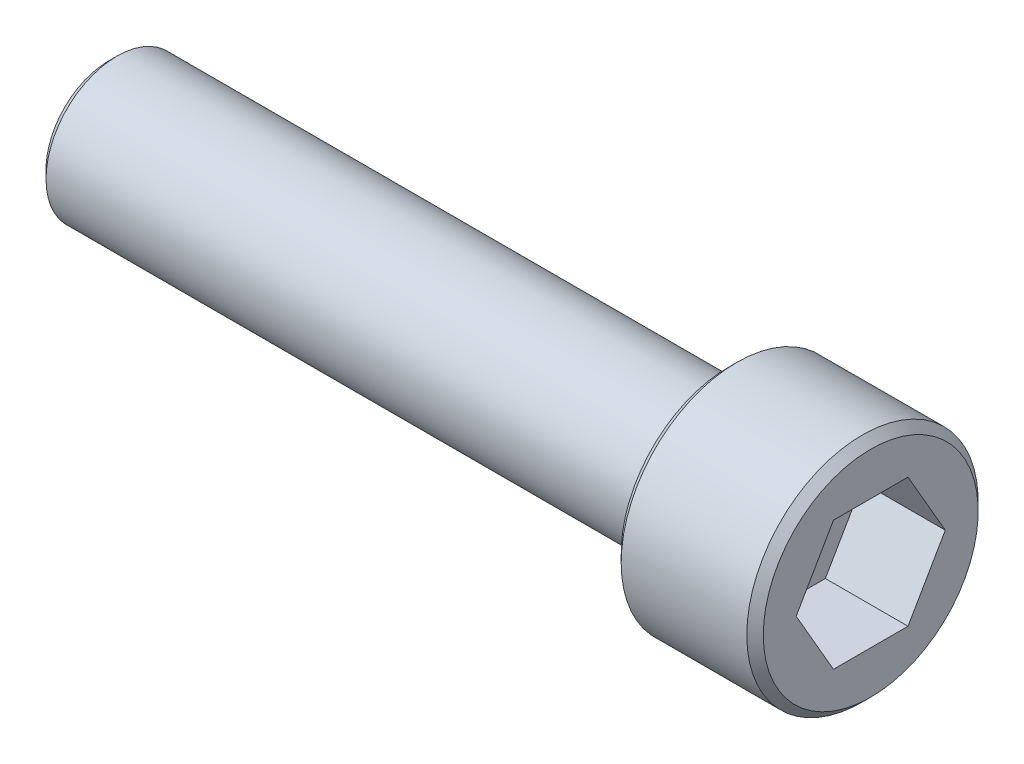
ISO-10303-21;
HEADER;
FILE_DESCRIPTION(('STEP AP214'),'2;1');
FILE_NAME('part.step','',(''),(''),'','','');
FILE_SCHEMA(('AUTOMOTIVE_DESIGN { 1 0 10303 214 1 1 1 1 }'));
ENDSEC;
DATA;
#1=APPLICATION_CONTEXT('core data for automotive mechanical design processes');
#2=APPLICATION_PROTOCOL_DEFINITION('international standard','automotive_design',2000,#1);
#3=PRODUCT_CONTEXT('',#1,'mechanical');
#4=PRODUCT('Part','Part','',(#3));
#5=PRODUCT_RELATED_PRODUCT_CATEGORY('part','',(#4));
#6=PRODUCT_DEFINITION_FORMATION('','',#4);
#7=PRODUCT_DEFINITION_CONTEXT('part definition',#1,'design');
#8=PRODUCT_DEFINITION('design','',#6,#7);
#9=PRODUCT_DEFINITION_SHAPE('','',#8);
#10=(LENGTH_UNIT() NAMED_UNIT(*) SI_UNIT(.MILLI.,.METRE.));
#11=(NAMED_UNIT(*) PLANE_ANGLE_UNIT() SI_UNIT($,.RADIAN.));
#12=(NAMED_UNIT(*) SI_UNIT($,.STERADIAN.) SOLID_ANGLE_UNIT());
#13=UNCERTAINTY_MEASURE_WITH_UNIT(LENGTH_MEASURE(1.E-05),#10,'distance_accuracy_value','');
#14=(GEOMETRIC_REPRESENTATION_CONTEXT(3) GLOBAL_UNCERTAINTY_ASSIGNED_CONTEXT((#13)) GLOBAL_UNIT_ASSIGNED_CONTEXT((#10,
#11,#12)) REPRESENTATION_CONTEXT('',''));
#15=CARTESIAN_POINT('',(0.,0.,0.));
#16=DIRECTION('',(0.,0.,1.));
#17=DIRECTION('',(1.,0.,0.));
#18=AXIS2_PLACEMENT_3D('',#15,#16,#17);
#19=CARTESIAN_POINT('',(10.4394,0.992187499999991,-0.572839720211604));
#20=DIRECTION('',(1.,0.,0.));
#21=DIRECTION('',(0.,0.,-1.));
#22=AXIS2_PLACEMENT_3D('',#19,#20,#21);
#23=PLANE('',#22);
#24=DIRECTION('',(0.,0.,-1.));
#25=VECTOR('',#24,1.);
#26=CARTESIAN_POINT('',(10.4393999999992,-0.992187499999797,0.572839720211604));
#27=LINE('',#26,#25);
#28=CARTESIAN_POINT('',(10.4393999999998,-0.992187499999804,0.572839720211616));
#29=VERTEX_POINT('',#28);
#30=CARTESIAN_POINT('',(10.4393999999994,-0.992187499999878,-0.57283972021157));
#31=VERTEX_POINT('',#30);
#32=EDGE_CURVE('E90',#29,#31,#27,.T.);
#33=ORIENTED_EDGE('',*,*,#32,.T.);
#34=DIRECTION('',(0.,0.866025403784437,-0.500000000000003));
#35=VECTOR('',#34,1.);
#36=CARTESIAN_POINT('',(10.4393999999992,-0.992187499999839,-0.572839720211604));
#37=LINE('',#36,#35);
#38=CARTESIAN_POINT('',(10.4393999999996,0.,-1.14567944042319));
#39=VERTEX_POINT('',#38);
#40=EDGE_CURVE('E134',#31,#39,#37,.T.);
#41=ORIENTED_EDGE('',*,*,#40,.T.);
#42=DIRECTION('',(0.,0.866025403784437,0.500000000000003));
#43=VECTOR('',#42,1.);
#44=CARTESIAN_POINT('',(10.4394,0.,-1.14567944042321));
#45=LINE('',#44,#43);
#46=CARTESIAN_POINT('',(10.4394,0.992187499999997,-0.572839720211613));
#47=VERTEX_POINT('',#46);
#48=EDGE_CURVE('E129',#39,#47,#45,.T.);
#49=ORIENTED_EDGE('',*,*,#48,.T.);
#50=DIRECTION('',(0.,0.,1.));
#51=VECTOR('',#50,1.);
#52=CARTESIAN_POINT('',(10.4394,0.992187499999991,-0.572839720211604));
#53=LINE('',#52,#51);
#54=CARTESIAN_POINT('',(10.4394,0.992187499999977,0.572839720211709));
#55=VERTEX_POINT('',#54);
#56=EDGE_CURVE('E73',#47,#55,#53,.T.);
#57=ORIENTED_EDGE('',*,*,#56,.T.);
#58=DIRECTION('',(0.,-0.866025403784437,0.500000000000003));
#59=VECTOR('',#58,1.);
#60=CARTESIAN_POINT('',(10.4394,0.992187500000213,0.572839720211604));
#61=LINE('',#60,#59);
#62=CARTESIAN_POINT('',(10.4394,1.1036917883848E-13,1.14567944042317));
#63=VERTEX_POINT('',#62);
#64=EDGE_CURVE('E70',#55,#63,#61,.T.);
#65=ORIENTED_EDGE('',*,*,#64,.T.);
#66=DIRECTION('',(0.,-0.866025403784437,-0.500000000000003));
#67=VECTOR('',#66,1.);
#68=CARTESIAN_POINT('',(10.4394,1.80411241501588E-13,1.14567944042321));
#69=LINE('',#68,#67);
#70=EDGE_CURVE('E67',#63,#29,#69,.T.);
#71=ORIENTED_EDGE('',*,*,#70,.T.);
#72=EDGE_LOOP('',(#33,#41,#49,#57,#65,#71));
#73=FACE_BOUND('',#72,.T.);
#74=ADVANCED_FACE('F16',(#73),#23,.T.);
#75=CARTESIAN_POINT('',(10.4394,0.992187500000213,0.572839720211604));
#76=DIRECTION('',(0.,0.500000000000003,0.866025403784437));
#77=DIRECTION('',(0.,-0.866025403784437,0.500000000000003));
#78=AXIS2_PLACEMENT_3D('',#75,#76,#77);
#79=PLANE('',#78);
#80=DIRECTION('',(1.,0.,0.));
#81=VECTOR('',#80,1.);
#82=CARTESIAN_POINT('',(10.4394,-1.0063905409263E-13,1.14567944042305));
#83=LINE('',#82,#81);
#84=CARTESIAN_POINT('',(11.7093999999998,0.,1.14567944042317));
#85=VERTEX_POINT('',#84);
#86=EDGE_CURVE('E76',#85,#63,#83,.F.);
#87=ORIENTED_EDGE('',*,*,#86,.T.);
#88=ORIENTED_EDGE('',*,*,#64,.F.);
#89=DIRECTION('',(1.,0.,0.));
#90=VECTOR('',#89,1.);
#91=CARTESIAN_POINT('',(10.4394,0.992187499999992,0.572839720211604));
#92=LINE('',#91,#90);
#93=CARTESIAN_POINT('',(11.7094,0.992187499999917,0.572839720211689));
#94=VERTEX_POINT('',#93);
#95=EDGE_CURVE('E124',#55,#94,#92,.T.);
#96=ORIENTED_EDGE('',*,*,#95,.T.);
#97=DIRECTION('',(0.,-0.866025403784437,0.500000000000002));
#98=VECTOR('',#97,1.);
#99=CARTESIAN_POINT('',(11.7094,0.992187499999839,0.572839720211604));
#100=LINE('',#99,#98);
#101=EDGE_CURVE('E81',#94,#85,#100,.T.);
#102=ORIENTED_EDGE('',*,*,#101,.T.);
#103=EDGE_LOOP('',(#87,#88,#96,#102));
#104=FACE_BOUND('',#103,.T.);
#105=ADVANCED_FACE('F79',(#104),#79,.F.);
#106=CARTESIAN_POINT('',(10.4394,1.80411241501588E-13,1.14567944042321));
#107=DIRECTION('',(0.,-0.500000000000003,0.866025403784437));
#108=DIRECTION('',(0.,-0.866025403784437,-0.500000000000003));
#109=AXIS2_PLACEMENT_3D('',#106,#107,#108);
#110=PLANE('',#109);
#111=DIRECTION('',(1.,0.,0.));
#112=VECTOR('',#111,1.);
#113=CARTESIAN_POINT('',(10.4393999999992,-0.992187499999797,0.572839720211604));
#114=LINE('',#113,#112);
#115=CARTESIAN_POINT('',(11.7093999999994,-0.992187499999897,0.572839720211616));
#116=VERTEX_POINT('',#115);
#117=EDGE_CURVE('E87',#116,#29,#114,.F.);
#118=ORIENTED_EDGE('',*,*,#117,.T.);
#119=ORIENTED_EDGE('',*,*,#70,.F.);
#120=ORIENTED_EDGE('',*,*,#86,.F.);
#121=DIRECTION('',(0.,-0.866025403784425,-0.500000000000023));
#122=VECTOR('',#121,1.);
#123=CARTESIAN_POINT('',(11.7094,-1.94289029309402E-13,1.14567944042321));
#124=LINE('',#123,#122);
#125=EDGE_CURVE('E121',#85,#116,#124,.T.);
#126=ORIENTED_EDGE('',*,*,#125,.T.);
#127=EDGE_LOOP('',(#118,#119,#120,#126));
#128=FACE_BOUND('',#127,.T.);
#129=ADVANCED_FACE('F85',(#128),#110,.F.);
#130=CARTESIAN_POINT('',(10.4393999999992,-0.992187499999797,0.572839720211604));
#131=DIRECTION('',(0.,-1.,0.));
#132=DIRECTION('',(0.,0.,-1.));
#133=AXIS2_PLACEMENT_3D('',#130,#131,#132);
#134=PLANE('',#133);
#135=DIRECTION('',(1.,0.,0.));
#136=VECTOR('',#135,1.);
#137=CARTESIAN_POINT('',(10.4393999999992,-0.99218750000012,-0.572839720211442));
#138=LINE('',#137,#136);
#139=CARTESIAN_POINT('',(11.7093999999996,-0.992187499999972,-0.57283972021157));
#140=VERTEX_POINT('',#139);
#141=EDGE_CURVE('E136',#140,#31,#138,.F.);
#142=ORIENTED_EDGE('',*,*,#141,.T.);
#143=ORIENTED_EDGE('',*,*,#32,.F.);
#144=ORIENTED_EDGE('',*,*,#117,.F.);
#145=DIRECTION('',(0.,0.,1.));
#146=VECTOR('',#145,1.);
#147=CARTESIAN_POINT('',(11.7094,-0.992187500000172,0.));
#148=LINE('',#147,#146);
#149=EDGE_CURVE('E119',#116,#140,#148,.F.);
#150=ORIENTED_EDGE('',*,*,#149,.T.);
#151=EDGE_LOOP('',(#142,#143,#144,#150));
#152=FACE_BOUND('',#151,.T.);
#153=ADVANCED_FACE('F141',(#152),#134,.F.);
#154=CARTESIAN_POINT('',(10.4393999999992,-0.992187499999839,-0.572839720211604));
#155=DIRECTION('',(0.,-0.500000000000003,-0.866025403784437));
#156=DIRECTION('',(0.,0.866025403784437,-0.500000000000003));
#157=AXIS2_PLACEMENT_3D('',#154,#155,#156);
#158=PLANE('',#157);
#159=DIRECTION('',(1.,0.,0.));
#160=VECTOR('',#159,1.);
#161=CARTESIAN_POINT('',(10.4394,-1.35331587588304E-13,-1.14567944042329));
#162=LINE('',#161,#160);
#163=CARTESIAN_POINT('',(11.7094,0.,-1.14567944042319));
#164=VERTEX_POINT('',#163);
#165=EDGE_CURVE('E131',#164,#39,#162,.F.);
#166=ORIENTED_EDGE('',*,*,#165,.T.);
#167=ORIENTED_EDGE('',*,*,#40,.F.);
#168=ORIENTED_EDGE('',*,*,#141,.F.);
#169=DIRECTION('',(0.,0.866025403784437,-0.500000000000002));
#170=VECTOR('',#169,1.);
#171=CARTESIAN_POINT('',(11.7094,-0.992187500000213,-0.572839720211604));
#172=LINE('',#171,#170);
#173=EDGE_CURVE('E117',#140,#164,#172,.T.);
#174=ORIENTED_EDGE('',*,*,#173,.T.);
#175=EDGE_LOOP('',(#166,#167,#168,#174));
#176=FACE_BOUND('',#175,.T.);
#177=ADVANCED_FACE('F145',(#176),#158,.F.);
#178=CARTESIAN_POINT('',(10.4394,0.,-1.14567944042321));
#179=DIRECTION('',(0.,0.500000000000003,-0.866025403784437));
#180=DIRECTION('',(0.,0.866025403784437,0.500000000000003));
#181=AXIS2_PLACEMENT_3D('',#178,#179,#180);
#182=PLANE('',#181);
#183=DIRECTION('',(1.,0.,0.));
#184=VECTOR('',#183,1.);
#185=CARTESIAN_POINT('',(10.4394,0.992187499999991,-0.572839720211604));
#186=LINE('',#185,#184);
#187=CARTESIAN_POINT('',(11.7094,0.992187499999951,-0.572839720211613));
#188=VERTEX_POINT('',#187);
#189=EDGE_CURVE('E127',#188,#47,#186,.F.);
#190=ORIENTED_EDGE('',*,*,#189,.T.);
#191=ORIENTED_EDGE('',*,*,#48,.F.);
#192=ORIENTED_EDGE('',*,*,#165,.F.);
#193=DIRECTION('',(0.,0.866025403784428,0.500000000000018));
#194=VECTOR('',#193,1.);
#195=CARTESIAN_POINT('',(11.7094,-1.80411241501588E-13,-1.14567944042321));
#196=LINE('',#195,#194);
#197=EDGE_CURVE('E34',#164,#188,#196,.T.);
#198=ORIENTED_EDGE('',*,*,#197,.T.);
#199=EDGE_LOOP('',(#190,#191,#192,#198));
#200=FACE_BOUND('',#199,.T.);
#201=ADVANCED_FACE('F147',(#200),#182,.F.);
#202=CARTESIAN_POINT('',(10.4394,0.992187499999991,-0.572839720211604));
#203=DIRECTION('',(0.,1.,0.));
#204=DIRECTION('',(0.,0.,1.));
#205=AXIS2_PLACEMENT_3D('',#202,#203,#204);
#206=PLANE('',#205);
#207=ORIENTED_EDGE('',*,*,#95,.F.);
#208=ORIENTED_EDGE('',*,*,#56,.F.);
#209=ORIENTED_EDGE('',*,*,#189,.F.);
#210=DIRECTION('',(0.,0.,1.));
#211=VECTOR('',#210,1.);
#212=CARTESIAN_POINT('',(11.7094,0.992187499999811,0.));
#213=LINE('',#212,#211);
#214=EDGE_CURVE('E113',#188,#94,#213,.T.);
#215=ORIENTED_EDGE('',*,*,#214,.T.);
#216=EDGE_LOOP('',(#207,#208,#209,#215));
#217=FACE_BOUND('',#216,.T.);
#218=ADVANCED_FACE('F150',(#217),#206,.F.);
#219=CARTESIAN_POINT('',(11.7094,1.77799999999982,0.));
#220=DIRECTION('',(-1.,0.,0.));
#221=DIRECTION('',(0.,0.,1.));
#222=AXIS2_PLACEMENT_3D('',#219,#220,#221);
#223=PLANE('',#222);
#224=CARTESIAN_POINT('',(11.7093999999724,-1.80411241501589E-13,0.));
#225=DIRECTION('',(-1.,0.,0.));
#226=DIRECTION('',(0.,0.,1.));
#227=AXIS2_PLACEMENT_3D('',#224,#225,#226);
#228=CIRCLE('',#227,1.65100000003804);
#229=CARTESIAN_POINT('',(11.7093999999724,-1.80411241501589E-13,1.65100000003804));
#230=VERTEX_POINT('',#229);
#231=EDGE_CURVE('E19',#230,#230,#228,.T.);
#232=ORIENTED_EDGE('',*,*,#231,.F.);
#233=EDGE_LOOP('',(#232));
#234=FACE_BOUND('',#233,.T.);
#235=ORIENTED_EDGE('',*,*,#197,.F.);
#236=ORIENTED_EDGE('',*,*,#173,.F.);
#237=ORIENTED_EDGE('',*,*,#149,.F.);
#238=ORIENTED_EDGE('',*,*,#125,.F.);
#239=ORIENTED_EDGE('',*,*,#101,.F.);
#240=ORIENTED_EDGE('',*,*,#214,.F.);
#241=EDGE_LOOP('',(#235,#236,#237,#238,#239,#240));
#242=FACE_BOUND('',#241,.T.);
#243=ADVANCED_FACE('F152',(#234,#242),#223,.F.);
#244=CARTESIAN_POINT('',(11.5824000001226,-1.80411241501589E-13,0.));
#245=DIRECTION('',(-1.,0.,0.));
#246=DIRECTION('',(0.,0.,1.));
#247=AXIS2_PLACEMENT_3D('',#244,#245,#246);
#248=CONICAL_SURFACE('',#247,1.77799999994477,0.785398163621248);
#249=ORIENTED_EDGE('',*,*,#231,.T.);
#250=EDGE_LOOP('',(#249));
#251=FACE_BOUND('',#250,.T.);
#252=CARTESIAN_POINT('',(11.5824,1.10608982237408E-13,0.));
#253=DIRECTION('',(-1.,0.,0.));
#254=DIRECTION('',(0.,0.,1.));
#255=AXIS2_PLACEMENT_3D('',#252,#253,#254);
#256=CIRCLE('',#255,1.77800000000001);
#257=CARTESIAN_POINT('',(11.5824,1.10608982237408E-13,1.77800000000003));
#258=VERTEX_POINT('',#257);
#259=EDGE_CURVE('E104',#258,#258,#256,.T.);
#260=ORIENTED_EDGE('',*,*,#259,.F.);
#261=EDGE_LOOP('',(#260));
#262=FACE_BOUND('',#261,.T.);
#263=ADVANCED_FACE('F154',(#251,#262),#248,.T.);
#264=CARTESIAN_POINT('',(-41.7285714285714,1.11022302462516E-13,0.));
#265=DIRECTION('',(-1.,0.,0.));
#266=DIRECTION('',(0.,0.,1.));
#267=AXIS2_PLACEMENT_3D('',#264,#265,#266);
#268=CYLINDRICAL_SURFACE('',#267,1.77800000000001);
#269=ORIENTED_EDGE('',*,*,#259,.T.);
#270=EDGE_LOOP('',(#269));
#271=FACE_BOUND('',#270,.T.);
#272=CARTESIAN_POINT('',(9.65199999996003,0.,0.));
#273=DIRECTION('',(1.,0.,0.));
#274=DIRECTION('',(0.,0.,-1.));
#275=AXIS2_PLACEMENT_3D('',#272,#273,#274);
#276=CIRCLE('',#275,1.77800000000161);
#277=CARTESIAN_POINT('',(9.65199999996003,0.,-1.77800000000161));
#278=VERTEX_POINT('',#277);
#279=EDGE_CURVE('E100',#278,#278,#276,.F.);
#280=ORIENTED_EDGE('',*,*,#279,.F.);
#281=EDGE_LOOP('',(#280));
#282=FACE_BOUND('',#281,.T.);
#283=ADVANCED_FACE('F162',(#271,#282),#268,.T.);
#284=CARTESIAN_POINT('',(9.65199999996003,0.,0.));
#285=DIRECTION('',(1.,0.,0.));
#286=DIRECTION('',(0.,0.,-1.));
#287=AXIS2_PLACEMENT_3D('',#284,#285,#286);
#288=CONICAL_SURFACE('',#287,1.77800000000161,0.785398163397448);
#289=CARTESIAN_POINT('',(9.52499999993961,0.,0.));
#290=DIRECTION('',(1.,0.,0.));
#291=DIRECTION('',(0.,0.,-1.));
#292=AXIS2_PLACEMENT_3D('',#289,#290,#291);
#293=CIRCLE('',#292,1.6509999999812);
#294=CARTESIAN_POINT('',(9.52499999993961,0.,-1.6509999999812));
#295=VERTEX_POINT('',#294);
#296=EDGE_CURVE('E98',#295,#295,#293,.T.);
#297=ORIENTED_EDGE('',*,*,#296,.T.);
#298=EDGE_LOOP('',(#297));
#299=FACE_BOUND('',#298,.T.);
#300=ORIENTED_EDGE('',*,*,#279,.T.);
#301=EDGE_LOOP('',(#300));
#302=FACE_BOUND('',#301,.T.);
#303=ADVANCED_FACE('F186',(#299,#302),#288,.T.);
#304=CARTESIAN_POINT('',(0.,0.,0.));
#305=DIRECTION('',(1.,0.,0.));
#306=DIRECTION('',(0.,0.,-1.));
#307=AXIS2_PLACEMENT_3D('',#304,#305,#306);
#308=PLANE('',#307);
#309=CARTESIAN_POINT('',(0.,0.,0.));
#310=DIRECTION('',(1.,0.,0.));
#311=DIRECTION('',(0.,0.,-1.));
#312=AXIS2_PLACEMENT_3D('',#309,#310,#311);
#313=CIRCLE('',#312,0.965199999996003);
#314=CARTESIAN_POINT('',(0.,0.,-0.965199999996003));
#315=VERTEX_POINT('',#314);
#316=EDGE_CURVE('E96',#315,#315,#313,.T.);
#317=ORIENTED_EDGE('',*,*,#316,.F.);
#318=EDGE_LOOP('',(#317));
#319=FACE_BOUND('',#318,.T.);
#320=ADVANCED_FACE('F182',(#319),#308,.F.);
#321=CARTESIAN_POINT('',(9.52500000000001,1.09220000000002,0.));
#322=DIRECTION('',(1.,0.,0.));
#323=DIRECTION('',(0.,0.,-1.));
#324=AXIS2_PLACEMENT_3D('',#321,#322,#323);
#325=PLANE('',#324);
#326=CARTESIAN_POINT('',(9.52500000000001,1.10624933269782E-13,0.));
#327=DIRECTION('',(-1.,0.,0.));
#328=DIRECTION('',(0.,0.,1.));
#329=AXIS2_PLACEMENT_3D('',#326,#327,#328);
#330=CIRCLE('',#329,1.09220000000001);
#331=CARTESIAN_POINT('',(9.52500000000001,1.10624933269782E-13,1.09220000000002));
#332=VERTEX_POINT('',#331);
#333=EDGE_CURVE('E25',#332,#332,#330,.T.);
#334=ORIENTED_EDGE('',*,*,#333,.F.);
#335=EDGE_LOOP('',(#334));
#336=FACE_BOUND('',#335,.T.);
#337=ORIENTED_EDGE('',*,*,#296,.F.);
#338=EDGE_LOOP('',(#337));
#339=FACE_BOUND('',#338,.T.);
#340=ADVANCED_FACE('F175',(#336,#339),#325,.F.);
#341=CARTESIAN_POINT('',(0.126999999963573,0.,0.));
#342=DIRECTION('',(1.,0.,0.));
#343=DIRECTION('',(0.,0.,-1.));
#344=AXIS2_PLACEMENT_3D('',#341,#342,#343);
#345=CONICAL_SURFACE('',#344,1.09219999995958,0.785398163397449);
#346=CARTESIAN_POINT('',(0.126999999999988,1.10697796010255E-13,0.));
#347=DIRECTION('',(-1.,0.,0.));
#348=DIRECTION('',(0.,0.,1.));
#349=AXIS2_PLACEMENT_3D('',#346,#347,#348);
#350=CIRCLE('',#349,1.09220000000001);
#351=CARTESIAN_POINT('',(0.126999999999988,1.10697796010255E-13,1.09220000000002));
#352=VERTEX_POINT('',#351);
#353=EDGE_CURVE('E11',#352,#352,#350,.F.);
#354=ORIENTED_EDGE('',*,*,#353,.F.);
#355=EDGE_LOOP('',(#354));
#356=FACE_BOUND('',#355,.T.);
#357=ORIENTED_EDGE('',*,*,#316,.T.);
#358=EDGE_LOOP('',(#357));
#359=FACE_BOUND('',#358,.T.);
#360=ADVANCED_FACE('F169',(#356,#359),#345,.T.);
#361=CARTESIAN_POINT('',(-41.7285714285714,1.11022302462516E-13,0.));
#362=DIRECTION('',(-1.,0.,0.));
#363=DIRECTION('',(0.,0.,1.));
#364=AXIS2_PLACEMENT_3D('',#361,#362,#363);
#365=CYLINDRICAL_SURFACE('',#364,1.09220000000001);
#366=ORIENTED_EDGE('',*,*,#353,.T.);
#367=EDGE_LOOP('',(#366));
#368=FACE_BOUND('',#367,.T.);
#369=ORIENTED_EDGE('',*,*,#333,.T.);
#370=EDGE_LOOP('',(#369));
#371=FACE_BOUND('',#370,.T.);
#372=ADVANCED_FACE('F167',(#368,#371),#365,.T.);
#373=CLOSED_SHELL('',(#74,#105,#129,#153,#177,#201,#218,#243,#263,#283,#303,#320,#340,#360,#372));
#374=MANIFOLD_SOLID_BREP('B1',#373);
#375=ADVANCED_BREP_SHAPE_REPRESENTATION('',(#18,#374),#14);
#376=SHAPE_DEFINITION_REPRESENTATION(#9,#375);
ENDSEC;
END-ISO-10303-21;
